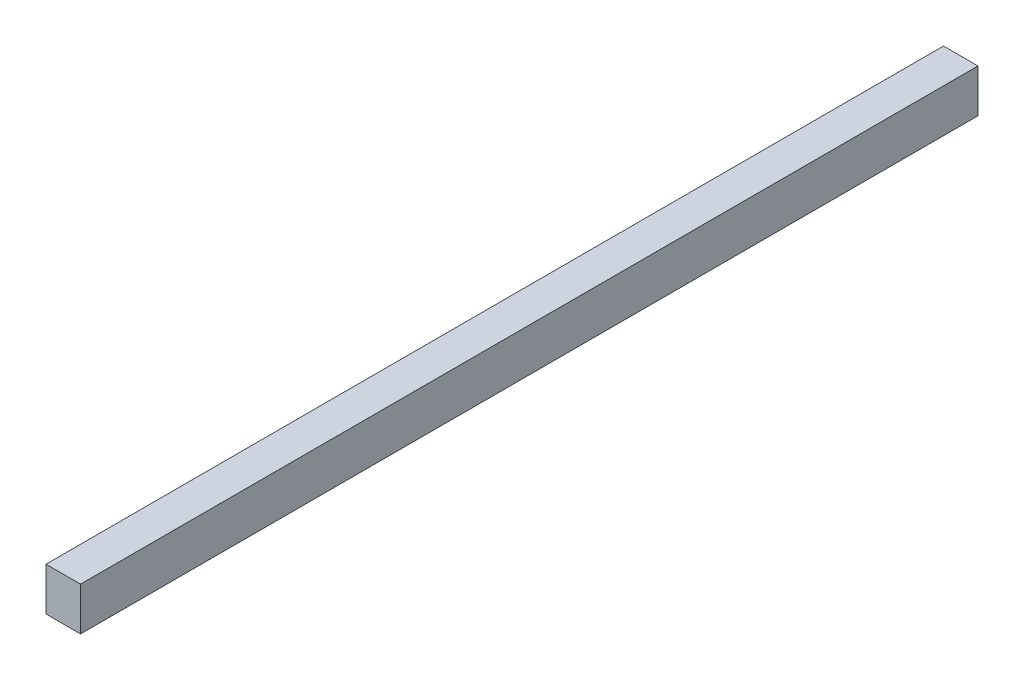
ISO-10303-21;
HEADER;
FILE_DESCRIPTION(('STEP AP214'),'2;1');
FILE_NAME('part.step','',(''),(''),'','','');
FILE_SCHEMA(('AUTOMOTIVE_DESIGN { 1 0 10303 214 1 1 1 1 }'));
ENDSEC;
DATA;
#1=APPLICATION_CONTEXT('core data for automotive mechanical design processes');
#2=APPLICATION_PROTOCOL_DEFINITION('international standard','automotive_design',2000,#1);
#3=PRODUCT_CONTEXT('',#1,'mechanical');
#4=PRODUCT('Part','Part','',(#3));
#5=PRODUCT_RELATED_PRODUCT_CATEGORY('part','',(#4));
#6=PRODUCT_DEFINITION_FORMATION('','',#4);
#7=PRODUCT_DEFINITION_CONTEXT('part definition',#1,'design');
#8=PRODUCT_DEFINITION('design','',#6,#7);
#9=PRODUCT_DEFINITION_SHAPE('','',#8);
#10=(LENGTH_UNIT() NAMED_UNIT(*) SI_UNIT(.MILLI.,.METRE.));
#11=(NAMED_UNIT(*) PLANE_ANGLE_UNIT() SI_UNIT($,.RADIAN.));
#12=(NAMED_UNIT(*) SI_UNIT($,.STERADIAN.) SOLID_ANGLE_UNIT());
#13=UNCERTAINTY_MEASURE_WITH_UNIT(LENGTH_MEASURE(1.E-05),#10,'distance_accuracy_value','');
#14=(GEOMETRIC_REPRESENTATION_CONTEXT(3) GLOBAL_UNCERTAINTY_ASSIGNED_CONTEXT((#13)) GLOBAL_UNIT_ASSIGNED_CONTEXT((#10,
#11,#12)) REPRESENTATION_CONTEXT('',''));
#15=CARTESIAN_POINT('',(0.,0.,0.));
#16=DIRECTION('',(0.,0.,1.));
#17=DIRECTION('',(1.,0.,0.));
#18=AXIS2_PLACEMENT_3D('',#15,#16,#17);
#19=CARTESIAN_POINT('',(0.,0.,52.));
#20=DIRECTION('',(1.,0.,0.));
#21=DIRECTION('',(0.,0.,-1.));
#22=AXIS2_PLACEMENT_3D('',#19,#20,#21);
#23=PLANE('',#22);
#24=DIRECTION('',(0.,-1.,0.));
#25=VECTOR('',#24,1.);
#26=CARTESIAN_POINT('',(0.,0.,-52.));
#27=LINE('',#26,#25);
#28=CARTESIAN_POINT('',(0.,5.,-52.));
#29=VERTEX_POINT('',#28);
#30=CARTESIAN_POINT('',(0.,0.,-52.));
#31=VERTEX_POINT('',#30);
#32=EDGE_CURVE('E96',#29,#31,#27,.T.);
#33=ORIENTED_EDGE('',*,*,#32,.T.);
#34=DIRECTION('',(0.,0.,-1.));
#35=VECTOR('',#34,1.);
#36=CARTESIAN_POINT('',(0.,0.,52.));
#37=LINE('',#36,#35);
#38=CARTESIAN_POINT('',(0.,0.,52.));
#39=VERTEX_POINT('',#38);
#40=EDGE_CURVE('E11',#39,#31,#37,.T.);
#41=ORIENTED_EDGE('',*,*,#40,.F.);
#42=DIRECTION('',(0.,-1.,0.));
#43=VECTOR('',#42,1.);
#44=CARTESIAN_POINT('',(0.,0.,52.));
#45=LINE('',#44,#43);
#46=CARTESIAN_POINT('',(0.,5.,52.));
#47=VERTEX_POINT('',#46);
#48=EDGE_CURVE('E84',#47,#39,#45,.T.);
#49=ORIENTED_EDGE('',*,*,#48,.F.);
#50=DIRECTION('',(0.,0.,-1.));
#51=VECTOR('',#50,1.);
#52=CARTESIAN_POINT('',(0.,5.,52.));
#53=LINE('',#52,#51);
#54=EDGE_CURVE('E92',#47,#29,#53,.T.);
#55=ORIENTED_EDGE('',*,*,#54,.T.);
#56=EDGE_LOOP('',(#33,#41,#49,#55));
#57=FACE_BOUND('',#56,.T.);
#58=ADVANCED_FACE('F33',(#57),#23,.F.);
#59=CARTESIAN_POINT('',(0.,0.,52.));
#60=DIRECTION('',(0.,1.,0.));
#61=DIRECTION('',(0.,0.,1.));
#62=AXIS2_PLACEMENT_3D('',#59,#60,#61);
#63=PLANE('',#62);
#64=DIRECTION('',(1.,0.,0.));
#65=VECTOR('',#64,1.);
#66=CARTESIAN_POINT('',(0.,0.,-52.));
#67=LINE('',#66,#65);
#68=CARTESIAN_POINT('',(4.,0.,-52.));
#69=VERTEX_POINT('',#68);
#70=EDGE_CURVE('E88',#31,#69,#67,.T.);
#71=ORIENTED_EDGE('',*,*,#70,.T.);
#72=DIRECTION('',(0.,0.,-1.));
#73=VECTOR('',#72,1.);
#74=CARTESIAN_POINT('',(4.,0.,52.));
#75=LINE('',#74,#73);
#76=CARTESIAN_POINT('',(4.,0.,52.));
#77=VERTEX_POINT('',#76);
#78=EDGE_CURVE('E41',#77,#69,#75,.T.);
#79=ORIENTED_EDGE('',*,*,#78,.F.);
#80=DIRECTION('',(1.,0.,0.));
#81=VECTOR('',#80,1.);
#82=CARTESIAN_POINT('',(0.,0.,52.));
#83=LINE('',#82,#81);
#84=EDGE_CURVE('E79',#39,#77,#83,.T.);
#85=ORIENTED_EDGE('',*,*,#84,.F.);
#86=ORIENTED_EDGE('',*,*,#40,.T.);
#87=EDGE_LOOP('',(#71,#79,#85,#86));
#88=FACE_BOUND('',#87,.T.);
#89=ADVANCED_FACE('F87',(#88),#63,.F.);
#90=CARTESIAN_POINT('',(4.,0.,52.));
#91=DIRECTION('',(-1.,0.,0.));
#92=DIRECTION('',(0.,0.,1.));
#93=AXIS2_PLACEMENT_3D('',#90,#91,#92);
#94=PLANE('',#93);
#95=DIRECTION('',(0.,1.,0.));
#96=VECTOR('',#95,1.);
#97=CARTESIAN_POINT('',(4.,0.,-52.));
#98=LINE('',#97,#96);
#99=CARTESIAN_POINT('',(4.,5.,-52.));
#100=VERTEX_POINT('',#99);
#101=EDGE_CURVE('E66',#69,#100,#98,.T.);
#102=ORIENTED_EDGE('',*,*,#101,.T.);
#103=DIRECTION('',(0.,0.,-1.));
#104=VECTOR('',#103,1.);
#105=CARTESIAN_POINT('',(4.,5.,52.));
#106=LINE('',#105,#104);
#107=CARTESIAN_POINT('',(4.,5.,52.));
#108=VERTEX_POINT('',#107);
#109=EDGE_CURVE('E89',#108,#100,#106,.T.);
#110=ORIENTED_EDGE('',*,*,#109,.F.);
#111=DIRECTION('',(0.,1.,0.));
#112=VECTOR('',#111,1.);
#113=CARTESIAN_POINT('',(4.,0.,52.));
#114=LINE('',#113,#112);
#115=EDGE_CURVE('E82',#77,#108,#114,.T.);
#116=ORIENTED_EDGE('',*,*,#115,.F.);
#117=ORIENTED_EDGE('',*,*,#78,.T.);
#118=EDGE_LOOP('',(#102,#110,#116,#117));
#119=FACE_BOUND('',#118,.T.);
#120=ADVANCED_FACE('F90',(#119),#94,.F.);
#121=CARTESIAN_POINT('',(0.,5.,52.));
#122=DIRECTION('',(0.,-1.,0.));
#123=DIRECTION('',(0.,0.,-1.));
#124=AXIS2_PLACEMENT_3D('',#121,#122,#123);
#125=PLANE('',#124);
#126=DIRECTION('',(-1.,0.,0.));
#127=VECTOR('',#126,1.);
#128=CARTESIAN_POINT('',(0.,5.,-52.));
#129=LINE('',#128,#127);
#130=EDGE_CURVE('E72',#100,#29,#129,.T.);
#131=ORIENTED_EDGE('',*,*,#130,.T.);
#132=ORIENTED_EDGE('',*,*,#54,.F.);
#133=DIRECTION('',(-1.,0.,0.));
#134=VECTOR('',#133,1.);
#135=CARTESIAN_POINT('',(0.,5.,52.));
#136=LINE('',#135,#134);
#137=EDGE_CURVE('E49',#108,#47,#136,.T.);
#138=ORIENTED_EDGE('',*,*,#137,.F.);
#139=ORIENTED_EDGE('',*,*,#109,.T.);
#140=EDGE_LOOP('',(#131,#132,#138,#139));
#141=FACE_BOUND('',#140,.T.);
#142=ADVANCED_FACE('F103',(#141),#125,.F.);
#143=CARTESIAN_POINT('',(0.,0.,52.));
#144=DIRECTION('',(0.,0.,-1.));
#145=DIRECTION('',(-1.,0.,0.));
#146=AXIS2_PLACEMENT_3D('',#143,#144,#145);
#147=PLANE('',#146);
#148=ORIENTED_EDGE('',*,*,#48,.T.);
#149=ORIENTED_EDGE('',*,*,#84,.T.);
#150=ORIENTED_EDGE('',*,*,#115,.T.);
#151=ORIENTED_EDGE('',*,*,#137,.T.);
#152=EDGE_LOOP('',(#148,#149,#150,#151));
#153=FACE_BOUND('',#152,.T.);
#154=ADVANCED_FACE('F80',(#153),#147,.F.);
#155=CARTESIAN_POINT('',(0.,0.,-52.));
#156=DIRECTION('',(0.,0.,-1.));
#157=DIRECTION('',(-1.,0.,0.));
#158=AXIS2_PLACEMENT_3D('',#155,#156,#157);
#159=PLANE('',#158);
#160=ORIENTED_EDGE('',*,*,#32,.F.);
#161=ORIENTED_EDGE('',*,*,#130,.F.);
#162=ORIENTED_EDGE('',*,*,#101,.F.);
#163=ORIENTED_EDGE('',*,*,#70,.F.);
#164=EDGE_LOOP('',(#160,#161,#162,#163));
#165=FACE_BOUND('',#164,.T.);
#166=ADVANCED_FACE('F106',(#165),#159,.T.);
#167=CLOSED_SHELL('',(#58,#89,#120,#142,#154,#166));
#168=MANIFOLD_SOLID_BREP('B2',#167);
#169=ADVANCED_BREP_SHAPE_REPRESENTATION('',(#18,#168),#14);
#170=SHAPE_DEFINITION_REPRESENTATION(#9,#169);
ENDSEC;
END-ISO-10303-21;
